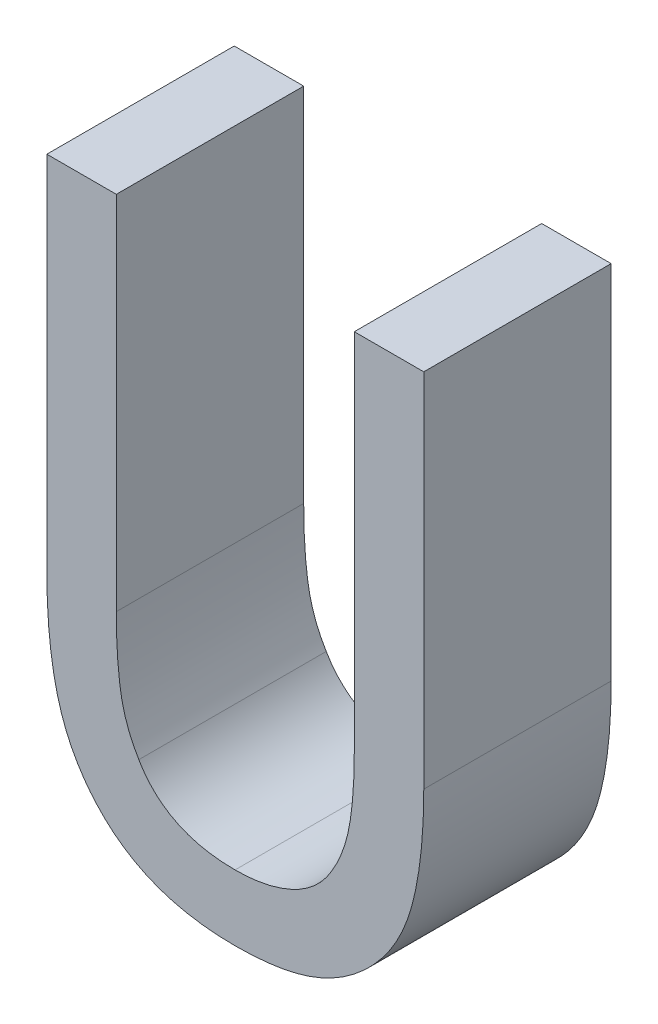
ISO-10303-21;
HEADER;
FILE_DESCRIPTION(('STEP AP214'),'2;1');
FILE_NAME('part.step','',(''),(''),'','','');
FILE_SCHEMA(('AUTOMOTIVE_DESIGN { 1 0 10303 214 1 1 1 1 }'));
ENDSEC;
DATA;
#1=APPLICATION_CONTEXT('core data for automotive mechanical design processes');
#2=APPLICATION_PROTOCOL_DEFINITION('international standard','automotive_design',2000,#1);
#3=PRODUCT_CONTEXT('',#1,'mechanical');
#4=PRODUCT('Part','Part','',(#3));
#5=PRODUCT_RELATED_PRODUCT_CATEGORY('part','',(#4));
#6=PRODUCT_DEFINITION_FORMATION('','',#4);
#7=PRODUCT_DEFINITION_CONTEXT('part definition',#1,'design');
#8=PRODUCT_DEFINITION('design','',#6,#7);
#9=PRODUCT_DEFINITION_SHAPE('','',#8);
#10=(LENGTH_UNIT() NAMED_UNIT(*) SI_UNIT(.MILLI.,.METRE.));
#11=(NAMED_UNIT(*) PLANE_ANGLE_UNIT() SI_UNIT($,.RADIAN.));
#12=(NAMED_UNIT(*) SI_UNIT($,.STERADIAN.) SOLID_ANGLE_UNIT());
#13=UNCERTAINTY_MEASURE_WITH_UNIT(LENGTH_MEASURE(1.E-05),#10,'distance_accuracy_value','');
#14=(GEOMETRIC_REPRESENTATION_CONTEXT(3) GLOBAL_UNCERTAINTY_ASSIGNED_CONTEXT((#13)) GLOBAL_UNIT_ASSIGNED_CONTEXT((#10,
#11,#12)) REPRESENTATION_CONTEXT('',''));
#15=CARTESIAN_POINT('',(0.,0.,0.));
#16=DIRECTION('',(0.,0.,1.));
#17=DIRECTION('',(1.,0.,0.));
#18=AXIS2_PLACEMENT_3D('',#15,#16,#17);
#19=CARTESIAN_POINT('',(-4.582835888152,0.305654139269393,0.));
#20=CARTESIAN_POINT('',(-4.582835888152,0.305654139269393,0.1));
#21=CARTESIAN_POINT('',(-4.582835888152,0.272589610839093,0.));
#22=CARTESIAN_POINT('',(-4.582835888152,0.272589610839093,0.1));
#23=CARTESIAN_POINT('',(-4.570812423269,0.227501617525047,0.));
#24=CARTESIAN_POINT('',(-4.570812423269,0.227501617525047,0.1));
#25=CARTESIAN_POINT('',(-4.556284069868,0.211470331013386,0.));
#26=CARTESIAN_POINT('',(-4.556284069868,0.211470331013386,0.1));
#27=B_SPLINE_SURFACE_WITH_KNOTS('',2,1,((#19,#20),(#21,#22),(#23,#24),(#25,#26)),.UNSPECIFIED.,
.F.,.F.,.F.,(3,1,3),(2,2),(-2.,-1.,0.),(0.,0.01),.UNSPECIFIED.);
#28=CARTESIAN_POINT('',(-4.556284069868,0.211470331013386,0.));
#29=CARTESIAN_POINT('',(-4.570812423269,0.227501617525047,0.));
#30=CARTESIAN_POINT('',(-4.582835888152,0.272589610839093,0.));
#31=CARTESIAN_POINT('',(-4.582835888152,0.305654139269393,0.));
#32=B_SPLINE_CURVE_WITH_KNOTS('',2,(#28,#29,#30,#31),.UNSPECIFIED.,.F.,.F.,(3,1,3),(0.,1.,2.),.UNSPECIFIED.);
#33=CARTESIAN_POINT('',(-4.556284069868,0.211470331013386,0.));
#34=VERTEX_POINT('',#33);
#35=CARTESIAN_POINT('',(-4.582835888152,0.305654139269393,0.));
#36=VERTEX_POINT('',#35);
#37=EDGE_CURVE('E11',#34,#36,#32,.T.);
#38=DIRECTION('',(0.,0.,1.));
#39=VECTOR('',#38,1.);
#40=CARTESIAN_POINT('',(-4.556284069868,0.211470331013386,0.));
#41=LINE('',#40,#39);
#42=CARTESIAN_POINT('',(-4.556284069868,0.211470331013386,0.1));
#43=VERTEX_POINT('',#42);
#44=EDGE_CURVE('E28',#34,#43,#41,.T.);
#45=CARTESIAN_POINT('',(-4.582835888152,0.305654139269393,0.1));
#46=CARTESIAN_POINT('',(-4.582835888152,0.272589610839093,0.1));
#47=CARTESIAN_POINT('',(-4.570812423269,0.227501617525047,0.1));
#48=CARTESIAN_POINT('',(-4.556284069868,0.211470331013386,0.1));
#49=B_SPLINE_CURVE_WITH_KNOTS('',2,(#45,#46,#47,#48),.UNSPECIFIED.,.F.,.F.,(3,1,3),(-2.,-1.,0.),.UNSPECIFIED.);
#50=CARTESIAN_POINT('',(-4.582835888152,0.305654139269393,0.1));
#51=VERTEX_POINT('',#50);
#52=EDGE_CURVE('E140',#51,#43,#49,.T.);
#53=DIRECTION('',(0.,0.,1.));
#54=VECTOR('',#53,1.);
#55=CARTESIAN_POINT('',(-4.582835888152,0.305654139269393,0.));
#56=LINE('',#55,#54);
#57=EDGE_CURVE('E299',#36,#51,#56,.T.);
#58=ORIENTED_EDGE('',*,*,#37,.F.);
#59=ORIENTED_EDGE('',*,*,#44,.T.);
#60=ORIENTED_EDGE('',*,*,#52,.F.);
#61=ORIENTED_EDGE('',*,*,#57,.F.);
#62=EDGE_LOOP('',(#58,#59,#60,#61));
#63=FACE_BOUND('',#62,.T.);
#64=ADVANCED_FACE('F17',(#63),#27,.T.);
#65=CARTESIAN_POINT('',(-4.582835888152,0.498530555112812,0.));
#66=DIRECTION('',(-1.,0.,0.));
#67=DIRECTION('',(0.,-1.,0.));
#68=AXIS2_PLACEMENT_3D('',#65,#66,#67);
#69=PLANE('',#68);
#70=DIRECTION('',(0.,1.,0.));
#71=VECTOR('',#70,1.);
#72=CARTESIAN_POINT('',(-4.582835888152,0.305654139269393,0.));
#73=LINE('',#72,#71);
#74=CARTESIAN_POINT('',(-4.582835888152,0.498530555112812,0.));
#75=VERTEX_POINT('',#74);
#76=EDGE_CURVE('E297',#36,#75,#73,.T.);
#77=ORIENTED_EDGE('',*,*,#76,.F.);
#78=ORIENTED_EDGE('',*,*,#57,.T.);
#79=DIRECTION('',(0.,-1.,0.));
#80=VECTOR('',#79,1.);
#81=CARTESIAN_POINT('',(-4.582835888152,0.305654139269393,0.1));
#82=LINE('',#81,#80);
#83=CARTESIAN_POINT('',(-4.582835888152,0.498530555112812,0.1));
#84=VERTEX_POINT('',#83);
#85=EDGE_CURVE('E295',#84,#51,#82,.T.);
#86=ORIENTED_EDGE('',*,*,#85,.F.);
#87=DIRECTION('',(0.,0.,1.));
#88=VECTOR('',#87,1.);
#89=CARTESIAN_POINT('',(-4.582835888152,0.498530555112812,0.));
#90=LINE('',#89,#88);
#91=EDGE_CURVE('E292',#75,#84,#90,.T.);
#92=ORIENTED_EDGE('',*,*,#91,.F.);
#93=EDGE_LOOP('',(#77,#78,#86,#92));
#94=FACE_BOUND('',#93,.T.);
#95=ADVANCED_FACE('F350',(#94),#69,.T.);
#96=CARTESIAN_POINT('',(-4.545763538094,0.498530555112812,0.));
#97=DIRECTION('',(0.,1.,0.));
#98=DIRECTION('',(-1.,0.,0.));
#99=AXIS2_PLACEMENT_3D('',#96,#97,#98);
#100=PLANE('',#99);
#101=DIRECTION('',(1.,0.,0.));
#102=VECTOR('',#101,1.);
#103=CARTESIAN_POINT('',(-4.582835888152,0.498530555112812,0.));
#104=LINE('',#103,#102);
#105=CARTESIAN_POINT('',(-4.545763538094,0.498530555112812,0.));
#106=VERTEX_POINT('',#105);
#107=EDGE_CURVE('E290',#75,#106,#104,.T.);
#108=ORIENTED_EDGE('',*,*,#107,.F.);
#109=ORIENTED_EDGE('',*,*,#91,.T.);
#110=DIRECTION('',(-1.,0.,0.));
#111=VECTOR('',#110,1.);
#112=CARTESIAN_POINT('',(-4.582835888152,0.498530555112812,0.1));
#113=LINE('',#112,#111);
#114=CARTESIAN_POINT('',(-4.545763538094,0.498530555112812,0.1));
#115=VERTEX_POINT('',#114);
#116=EDGE_CURVE('E287',#115,#84,#113,.T.);
#117=ORIENTED_EDGE('',*,*,#116,.F.);
#118=DIRECTION('',(0.,0.,1.));
#119=VECTOR('',#118,1.);
#120=CARTESIAN_POINT('',(-4.545763538094,0.498530555112812,0.));
#121=LINE('',#120,#119);
#122=EDGE_CURVE('E284',#106,#115,#121,.T.);
#123=ORIENTED_EDGE('',*,*,#122,.F.);
#124=EDGE_LOOP('',(#108,#109,#117,#123));
#125=FACE_BOUND('',#124,.T.);
#126=ADVANCED_FACE('F346',(#125),#100,.T.);
#127=CARTESIAN_POINT('',(-4.545763538094,0.305654139269393,0.));
#128=DIRECTION('',(1.,0.,0.));
#129=DIRECTION('',(0.,1.,0.));
#130=AXIS2_PLACEMENT_3D('',#127,#128,#129);
#131=PLANE('',#130);
#132=DIRECTION('',(0.,-1.,0.));
#133=VECTOR('',#132,1.);
#134=CARTESIAN_POINT('',(-4.545763538094,0.498530555112812,0.));
#135=LINE('',#134,#133);
#136=CARTESIAN_POINT('',(-4.545763538094,0.305654139269393,0.));
#137=VERTEX_POINT('',#136);
#138=EDGE_CURVE('E282',#106,#137,#135,.T.);
#139=ORIENTED_EDGE('',*,*,#138,.F.);
#140=ORIENTED_EDGE('',*,*,#122,.T.);
#141=DIRECTION('',(0.,1.,0.));
#142=VECTOR('',#141,1.);
#143=CARTESIAN_POINT('',(-4.545763538094,0.498530555112812,0.1));
#144=LINE('',#143,#142);
#145=CARTESIAN_POINT('',(-4.545763538094,0.305654139269393,0.1));
#146=VERTEX_POINT('',#145);
#147=EDGE_CURVE('E279',#146,#115,#144,.T.);
#148=ORIENTED_EDGE('',*,*,#147,.F.);
#149=DIRECTION('',(0.,0.,1.));
#150=VECTOR('',#149,1.);
#151=CARTESIAN_POINT('',(-4.545763538094,0.305654139269393,0.));
#152=LINE('',#151,#150);
#153=EDGE_CURVE('E273',#137,#146,#152,.T.);
#154=ORIENTED_EDGE('',*,*,#153,.F.);
#155=EDGE_LOOP('',(#139,#140,#148,#154));
#156=FACE_BOUND('',#155,.T.);
#157=ADVANCED_FACE('F342',(#156),#131,.T.);
#158=CARTESIAN_POINT('',(-4.533740073211,0.243282415184963,0.));
#159=CARTESIAN_POINT('',(-4.533740073211,0.243282415184963,0.1));
#160=CARTESIAN_POINT('',(-4.541004249911,0.255055391216964,0.));
#161=CARTESIAN_POINT('',(-4.541004249911,0.255055391216964,0.1));
#162=CARTESIAN_POINT('',(-4.545763538094,0.284112098019349,0.));
#163=CARTESIAN_POINT('',(-4.545763538094,0.284112098019349,0.1));
#164=CARTESIAN_POINT('',(-4.545763538094,0.305654139269393,0.));
#165=CARTESIAN_POINT('',(-4.545763538094,0.305654139269393,0.1));
#166=B_SPLINE_SURFACE_WITH_KNOTS('',2,1,((#158,#159),(#160,#161),(#162,#163),(#164,#165)),
.UNSPECIFIED.,.F.,.F.,.F.,(3,1,3),(2,2),(-2.,-1.,0.),(0.,0.01),.UNSPECIFIED.);
#167=CARTESIAN_POINT('',(-4.545763538094,0.305654139269393,0.));
#168=CARTESIAN_POINT('',(-4.545763538094,0.284112098019349,0.));
#169=CARTESIAN_POINT('',(-4.541004249911,0.255055391216964,0.));
#170=CARTESIAN_POINT('',(-4.533740073211,0.243282415184963,0.));
#171=B_SPLINE_CURVE_WITH_KNOTS('',2,(#167,#168,#169,#170),.UNSPECIFIED.,.F.,.F.,(3,1,3),(0.,1.,
2.),.UNSPECIFIED.);
#172=CARTESIAN_POINT('',(-4.533740073211,0.243282415184963,0.));
#173=VERTEX_POINT('',#172);
#174=EDGE_CURVE('E266',#137,#173,#171,.T.);
#175=CARTESIAN_POINT('',(-4.533740073211,0.243282415184963,0.1));
#176=CARTESIAN_POINT('',(-4.541004249911,0.255055391216964,0.1));
#177=CARTESIAN_POINT('',(-4.545763538094,0.284112098019349,0.1));
#178=CARTESIAN_POINT('',(-4.545763538094,0.305654139269393,0.1));
#179=B_SPLINE_CURVE_WITH_KNOTS('',2,(#175,#176,#177,#178),.UNSPECIFIED.,.F.,.F.,(3,1,3),(-2.,
-1.,0.),.UNSPECIFIED.);
#180=CARTESIAN_POINT('',(-4.533740073211,0.243282415184963,0.1));
#181=VERTEX_POINT('',#180);
#182=EDGE_CURVE('E261',#181,#146,#179,.T.);
#183=DIRECTION('',(0.,0.,1.));
#184=VECTOR('',#183,1.);
#185=CARTESIAN_POINT('',(-4.533740073211,0.243282415184963,0.));
#186=LINE('',#185,#184);
#187=EDGE_CURVE('E255',#173,#181,#186,.T.);
#188=ORIENTED_EDGE('',*,*,#174,.F.);
#189=ORIENTED_EDGE('',*,*,#153,.T.);
#190=ORIENTED_EDGE('',*,*,#182,.F.);
#191=ORIENTED_EDGE('',*,*,#187,.F.);
#192=EDGE_LOOP('',(#188,#189,#190,#191));
#193=FACE_BOUND('',#192,.T.);
#194=ADVANCED_FACE('F338',(#193),#166,.T.);
#195=CARTESIAN_POINT('',(-4.482389858603,0.217983041158748,0.));
#196=CARTESIAN_POINT('',(-4.482389858603,0.217983041158748,0.1));
#197=CARTESIAN_POINT('',(-4.500926033632,0.217983041158748,0.));
#198=CARTESIAN_POINT('',(-4.500926033632,0.217983041158748,0.1));
#199=CARTESIAN_POINT('',(-4.52647589651,0.230757972597728,0.));
#200=CARTESIAN_POINT('',(-4.52647589651,0.230757972597728,0.1));
#201=CARTESIAN_POINT('',(-4.533740073211,0.243282415184963,0.));
#202=CARTESIAN_POINT('',(-4.533740073211,0.243282415184963,0.1));
#203=B_SPLINE_SURFACE_WITH_KNOTS('',2,1,((#195,#196),(#197,#198),(#199,#200),(#201,#202)),
.UNSPECIFIED.,.F.,.F.,.F.,(3,1,3),(2,2),(-2.,-1.,0.),(0.,0.01),.UNSPECIFIED.);
#204=CARTESIAN_POINT('',(-4.533740073211,0.243282415184963,0.));
#205=CARTESIAN_POINT('',(-4.52647589651,0.230757972597728,0.));
#206=CARTESIAN_POINT('',(-4.500926033632,0.217983041158748,0.));
#207=CARTESIAN_POINT('',(-4.482389858603,0.217983041158748,0.));
#208=B_SPLINE_CURVE_WITH_KNOTS('',2,(#204,#205,#206,#207),.UNSPECIFIED.,.F.,.F.,(3,1,3),(0.,1.,
2.),.UNSPECIFIED.);
#209=CARTESIAN_POINT('',(-4.482389858603,0.217983041158748,0.));
#210=VERTEX_POINT('',#209);
#211=EDGE_CURVE('E248',#173,#210,#208,.T.);
#212=CARTESIAN_POINT('',(-4.482389858603,0.217983041158748,0.1));
#213=CARTESIAN_POINT('',(-4.500926033632,0.217983041158748,0.1));
#214=CARTESIAN_POINT('',(-4.52647589651,0.230757972597728,0.1));
#215=CARTESIAN_POINT('',(-4.533740073211,0.243282415184963,0.1));
#216=B_SPLINE_CURVE_WITH_KNOTS('',2,(#212,#213,#214,#215),.UNSPECIFIED.,.F.,.F.,(3,1,3),(-2.,
-1.,0.),.UNSPECIFIED.);
#217=CARTESIAN_POINT('',(-4.482389858603,0.217983041158748,0.1));
#218=VERTEX_POINT('',#217);
#219=EDGE_CURVE('E243',#218,#181,#216,.T.);
#220=DIRECTION('',(0.,0.,1.));
#221=VECTOR('',#220,1.);
#222=CARTESIAN_POINT('',(-4.482389858603,0.217983041158748,0.));
#223=LINE('',#222,#221);
#224=EDGE_CURVE('E237',#210,#218,#223,.T.);
#225=ORIENTED_EDGE('',*,*,#211,.F.);
#226=ORIENTED_EDGE('',*,*,#187,.T.);
#227=ORIENTED_EDGE('',*,*,#219,.F.);
#228=ORIENTED_EDGE('',*,*,#224,.F.);
#229=EDGE_LOOP('',(#225,#226,#227,#228));
#230=FACE_BOUND('',#229,.T.);
#231=ADVANCED_FACE('F334',(#230),#203,.T.);
#232=CARTESIAN_POINT('',(-4.430789155143,0.243282415184963,0.));
#233=CARTESIAN_POINT('',(-4.430789155143,0.243282415184963,0.1));
#234=CARTESIAN_POINT('',(-4.438053331844,0.230757972597728,0.));
#235=CARTESIAN_POINT('',(-4.438053331844,0.230757972597728,0.1));
#236=CARTESIAN_POINT('',(-4.465106127832,0.217983041158748,0.));
#237=CARTESIAN_POINT('',(-4.465106127832,0.217983041158748,0.1));
#238=CARTESIAN_POINT('',(-4.482389858603,0.217983041158748,0.));
#239=CARTESIAN_POINT('',(-4.482389858603,0.217983041158748,0.1));
#240=B_SPLINE_SURFACE_WITH_KNOTS('',2,1,((#232,#233),(#234,#235),(#236,#237),(#238,#239)),
.UNSPECIFIED.,.F.,.F.,.F.,(3,1,3),(2,2),(-2.,-1.,0.),(0.,0.01),.UNSPECIFIED.);
#241=CARTESIAN_POINT('',(-4.482389858603,0.217983041158748,0.));
#242=CARTESIAN_POINT('',(-4.465106127832,0.217983041158748,0.));
#243=CARTESIAN_POINT('',(-4.438053331844,0.230757972597728,0.));
#244=CARTESIAN_POINT('',(-4.430789155143,0.243282415184963,0.));
#245=B_SPLINE_CURVE_WITH_KNOTS('',2,(#241,#242,#243,#244),.UNSPECIFIED.,.F.,.F.,(3,1,3),(0.,1.,
2.),.UNSPECIFIED.);
#246=CARTESIAN_POINT('',(-4.430789155143,0.243282415184963,0.));
#247=VERTEX_POINT('',#246);
#248=EDGE_CURVE('E230',#210,#247,#245,.T.);
#249=CARTESIAN_POINT('',(-4.430789155143,0.243282415184963,0.1));
#250=CARTESIAN_POINT('',(-4.438053331844,0.230757972597728,0.1));
#251=CARTESIAN_POINT('',(-4.465106127832,0.217983041158748,0.1));
#252=CARTESIAN_POINT('',(-4.482389858603,0.217983041158748,0.1));
#253=B_SPLINE_CURVE_WITH_KNOTS('',2,(#249,#250,#251,#252),.UNSPECIFIED.,.F.,.F.,(3,1,3),(-2.,
-1.,0.),.UNSPECIFIED.);
#254=CARTESIAN_POINT('',(-4.430789155143,0.243282415184963,0.1));
#255=VERTEX_POINT('',#254);
#256=EDGE_CURVE('E225',#255,#218,#253,.T.);
#257=DIRECTION('',(0.,0.,1.));
#258=VECTOR('',#257,1.);
#259=CARTESIAN_POINT('',(-4.430789155143,0.243282415184963,0.));
#260=LINE('',#259,#258);
#261=EDGE_CURVE('E219',#247,#255,#260,.T.);
#262=ORIENTED_EDGE('',*,*,#248,.F.);
#263=ORIENTED_EDGE('',*,*,#224,.T.);
#264=ORIENTED_EDGE('',*,*,#256,.F.);
#265=ORIENTED_EDGE('',*,*,#261,.F.);
#266=EDGE_LOOP('',(#262,#263,#264,#265));
#267=FACE_BOUND('',#266,.T.);
#268=ADVANCED_FACE('F330',(#267),#240,.T.);
#269=CARTESIAN_POINT('',(-4.41876569026,0.304652183862414,0.));
#270=CARTESIAN_POINT('',(-4.41876569026,0.304652183862414,0.1));
#271=CARTESIAN_POINT('',(-4.41876569026,0.283861609167604,0.));
#272=CARTESIAN_POINT('',(-4.41876569026,0.283861609167604,0.1));
#273=CARTESIAN_POINT('',(-4.423775467295,0.255055391216964,0.));
#274=CARTESIAN_POINT('',(-4.423775467295,0.255055391216964,0.1));
#275=CARTESIAN_POINT('',(-4.430789155143,0.243282415184963,0.));
#276=CARTESIAN_POINT('',(-4.430789155143,0.243282415184963,0.1));
#277=B_SPLINE_SURFACE_WITH_KNOTS('',2,1,((#269,#270),(#271,#272),(#273,#274),(#275,#276)),
.UNSPECIFIED.,.F.,.F.,.F.,(3,1,3),(2,2),(-2.,-1.,0.),(0.,0.01),.UNSPECIFIED.);
#278=CARTESIAN_POINT('',(-4.430789155143,0.243282415184963,0.));
#279=CARTESIAN_POINT('',(-4.423775467295,0.255055391216964,0.));
#280=CARTESIAN_POINT('',(-4.41876569026,0.283861609167604,0.));
#281=CARTESIAN_POINT('',(-4.41876569026,0.304652183862414,0.));
#282=B_SPLINE_CURVE_WITH_KNOTS('',2,(#278,#279,#280,#281),.UNSPECIFIED.,.F.,.F.,(3,1,3),(0.,1.,
2.),.UNSPECIFIED.);
#283=CARTESIAN_POINT('',(-4.41876569026,0.304652183862414,0.));
#284=VERTEX_POINT('',#283);
#285=EDGE_CURVE('E212',#247,#284,#282,.T.);
#286=CARTESIAN_POINT('',(-4.41876569026,0.304652183862414,0.1));
#287=CARTESIAN_POINT('',(-4.41876569026,0.283861609167604,0.1));
#288=CARTESIAN_POINT('',(-4.423775467295,0.255055391216964,0.1));
#289=CARTESIAN_POINT('',(-4.430789155143,0.243282415184963,0.1));
#290=B_SPLINE_CURVE_WITH_KNOTS('',2,(#286,#287,#288,#289),.UNSPECIFIED.,.F.,.F.,(3,1,3),(-2.,
-1.,0.),.UNSPECIFIED.);
#291=CARTESIAN_POINT('',(-4.41876569026,0.304652183862414,0.1));
#292=VERTEX_POINT('',#291);
#293=EDGE_CURVE('E207',#292,#255,#290,.T.);
#294=DIRECTION('',(0.,0.,1.));
#295=VECTOR('',#294,1.);
#296=CARTESIAN_POINT('',(-4.41876569026,0.304652183862414,0.));
#297=LINE('',#296,#295);
#298=EDGE_CURVE('E204',#284,#292,#297,.T.);
#299=ORIENTED_EDGE('',*,*,#285,.F.);
#300=ORIENTED_EDGE('',*,*,#261,.T.);
#301=ORIENTED_EDGE('',*,*,#293,.F.);
#302=ORIENTED_EDGE('',*,*,#298,.F.);
#303=EDGE_LOOP('',(#299,#300,#301,#302));
#304=FACE_BOUND('',#303,.T.);
#305=ADVANCED_FACE('F326',(#304),#277,.T.);
#306=CARTESIAN_POINT('',(-4.41876569026,0.498530555112812,0.));
#307=DIRECTION('',(-1.,0.,0.));
#308=DIRECTION('',(0.,-1.,0.));
#309=AXIS2_PLACEMENT_3D('',#306,#307,#308);
#310=PLANE('',#309);
#311=DIRECTION('',(0.,1.,0.));
#312=VECTOR('',#311,1.);
#313=CARTESIAN_POINT('',(-4.41876569026,0.304652183862414,0.));
#314=LINE('',#313,#312);
#315=CARTESIAN_POINT('',(-4.41876569026,0.498530555112812,0.));
#316=VERTEX_POINT('',#315);
#317=EDGE_CURVE('E202',#284,#316,#314,.T.);
#318=ORIENTED_EDGE('',*,*,#317,.F.);
#319=ORIENTED_EDGE('',*,*,#298,.T.);
#320=DIRECTION('',(0.,-1.,0.));
#321=VECTOR('',#320,1.);
#322=CARTESIAN_POINT('',(-4.41876569026,0.304652183862414,0.1));
#323=LINE('',#322,#321);
#324=CARTESIAN_POINT('',(-4.41876569026,0.498530555112812,0.1));
#325=VERTEX_POINT('',#324);
#326=EDGE_CURVE('E199',#325,#292,#323,.T.);
#327=ORIENTED_EDGE('',*,*,#326,.F.);
#328=DIRECTION('',(0.,0.,1.));
#329=VECTOR('',#328,1.);
#330=CARTESIAN_POINT('',(-4.41876569026,0.498530555112812,0.));
#331=LINE('',#330,#329);
#332=EDGE_CURVE('E196',#316,#325,#331,.T.);
#333=ORIENTED_EDGE('',*,*,#332,.F.);
#334=EDGE_LOOP('',(#318,#319,#327,#333));
#335=FACE_BOUND('',#334,.T.);
#336=ADVANCED_FACE('F322',(#335),#310,.T.);
#337=CARTESIAN_POINT('',(-4.381693340201,0.498530555112812,0.));
#338=DIRECTION('',(0.,1.,0.));
#339=DIRECTION('',(-1.,0.,0.));
#340=AXIS2_PLACEMENT_3D('',#337,#338,#339);
#341=PLANE('',#340);
#342=DIRECTION('',(1.,0.,0.));
#343=VECTOR('',#342,1.);
#344=CARTESIAN_POINT('',(-4.41876569026,0.498530555112812,0.));
#345=LINE('',#344,#343);
#346=CARTESIAN_POINT('',(-4.381693340201,0.498530555112812,0.));
#347=VERTEX_POINT('',#346);
#348=EDGE_CURVE('E194',#316,#347,#345,.T.);
#349=ORIENTED_EDGE('',*,*,#348,.F.);
#350=ORIENTED_EDGE('',*,*,#332,.T.);
#351=DIRECTION('',(-1.,0.,0.));
#352=VECTOR('',#351,1.);
#353=CARTESIAN_POINT('',(-4.41876569026,0.498530555112812,0.1));
#354=LINE('',#353,#352);
#355=CARTESIAN_POINT('',(-4.381693340201,0.498530555112812,0.1));
#356=VERTEX_POINT('',#355);
#357=EDGE_CURVE('E191',#356,#325,#354,.T.);
#358=ORIENTED_EDGE('',*,*,#357,.F.);
#359=DIRECTION('',(0.,0.,1.));
#360=VECTOR('',#359,1.);
#361=CARTESIAN_POINT('',(-4.381693340201,0.498530555112812,0.));
#362=LINE('',#361,#360);
#363=EDGE_CURVE('E188',#347,#356,#362,.T.);
#364=ORIENTED_EDGE('',*,*,#363,.F.);
#365=EDGE_LOOP('',(#349,#350,#358,#364));
#366=FACE_BOUND('',#365,.T.);
#367=ADVANCED_FACE('F318',(#366),#341,.T.);
#368=CARTESIAN_POINT('',(-4.381693340201,0.305654139269393,0.));
#369=DIRECTION('',(1.,0.,0.));
#370=DIRECTION('',(0.,1.,0.));
#371=AXIS2_PLACEMENT_3D('',#368,#369,#370);
#372=PLANE('',#371);
#373=DIRECTION('',(0.,-1.,0.));
#374=VECTOR('',#373,1.);
#375=CARTESIAN_POINT('',(-4.381693340201,0.498530555112812,0.));
#376=LINE('',#375,#374);
#377=CARTESIAN_POINT('',(-4.381693340201,0.305654139269393,0.));
#378=VERTEX_POINT('',#377);
#379=EDGE_CURVE('E186',#347,#378,#376,.T.);
#380=ORIENTED_EDGE('',*,*,#379,.F.);
#381=ORIENTED_EDGE('',*,*,#363,.T.);
#382=DIRECTION('',(0.,1.,0.));
#383=VECTOR('',#382,1.);
#384=CARTESIAN_POINT('',(-4.381693340201,0.498530555112812,0.1));
#385=LINE('',#384,#383);
#386=CARTESIAN_POINT('',(-4.381693340201,0.305654139269393,0.1));
#387=VERTEX_POINT('',#386);
#388=EDGE_CURVE('E183',#387,#356,#385,.T.);
#389=ORIENTED_EDGE('',*,*,#388,.F.);
#390=DIRECTION('',(0.,0.,1.));
#391=VECTOR('',#390,1.);
#392=CARTESIAN_POINT('',(-4.381693340201,0.305654139269393,0.));
#393=LINE('',#392,#391);
#394=EDGE_CURVE('E177',#378,#387,#393,.T.);
#395=ORIENTED_EDGE('',*,*,#394,.F.);
#396=EDGE_LOOP('',(#380,#381,#389,#395));
#397=FACE_BOUND('',#396,.T.);
#398=ADVANCED_FACE('F314',(#397),#372,.T.);
#399=CARTESIAN_POINT('',(-4.408245158486,0.211470331013386,0.));
#400=CARTESIAN_POINT('',(-4.408245158486,0.211470331013386,0.1));
#401=CARTESIAN_POINT('',(-4.393466316233,0.227251128673302,0.));
#402=CARTESIAN_POINT('',(-4.393466316233,0.227251128673302,0.1));
#403=CARTESIAN_POINT('',(-4.381693340201,0.273341077394327,0.));
#404=CARTESIAN_POINT('',(-4.381693340201,0.273341077394327,0.1));
#405=CARTESIAN_POINT('',(-4.381693340201,0.305654139269393,0.));
#406=CARTESIAN_POINT('',(-4.381693340201,0.305654139269393,0.1));
#407=B_SPLINE_SURFACE_WITH_KNOTS('',2,1,((#399,#400),(#401,#402),(#403,#404),(#405,#406)),
.UNSPECIFIED.,.F.,.F.,.F.,(3,1,3),(2,2),(-2.,-1.,0.),(0.,0.01),.UNSPECIFIED.);
#408=CARTESIAN_POINT('',(-4.381693340201,0.305654139269393,0.));
#409=CARTESIAN_POINT('',(-4.381693340201,0.273341077394327,0.));
#410=CARTESIAN_POINT('',(-4.393466316233,0.227251128673302,0.));
#411=CARTESIAN_POINT('',(-4.408245158486,0.211470331013386,0.));
#412=B_SPLINE_CURVE_WITH_KNOTS('',2,(#408,#409,#410,#411),.UNSPECIFIED.,.F.,.F.,(3,1,3),(0.,1.,
2.),.UNSPECIFIED.);
#413=CARTESIAN_POINT('',(-4.408245158486,0.211470331013386,0.));
#414=VERTEX_POINT('',#413);
#415=EDGE_CURVE('E170',#378,#414,#412,.T.);
#416=CARTESIAN_POINT('',(-4.408245158486,0.211470331013386,0.1));
#417=CARTESIAN_POINT('',(-4.393466316233,0.227251128673302,0.1));
#418=CARTESIAN_POINT('',(-4.381693340201,0.273341077394327,0.1));
#419=CARTESIAN_POINT('',(-4.381693340201,0.305654139269393,0.1));
#420=B_SPLINE_CURVE_WITH_KNOTS('',2,(#416,#417,#418,#419),.UNSPECIFIED.,.F.,.F.,(3,1,3),(-2.,
-1.,0.),.UNSPECIFIED.);
#421=CARTESIAN_POINT('',(-4.408245158486,0.211470331013386,0.1));
#422=VERTEX_POINT('',#421);
#423=EDGE_CURVE('E166',#422,#387,#420,.T.);
#424=DIRECTION('',(0.,0.,1.));
#425=VECTOR('',#424,1.);
#426=CARTESIAN_POINT('',(-4.408245158486,0.211470331013386,0.));
#427=LINE('',#426,#425);
#428=EDGE_CURVE('E125',#414,#422,#427,.T.);
#429=ORIENTED_EDGE('',*,*,#415,.F.);
#430=ORIENTED_EDGE('',*,*,#394,.T.);
#431=ORIENTED_EDGE('',*,*,#423,.F.);
#432=ORIENTED_EDGE('',*,*,#428,.F.);
#433=EDGE_LOOP('',(#429,#430,#431,#432));
#434=FACE_BOUND('',#433,.T.);
#435=ADVANCED_FACE('F312',(#434),#407,.T.);
#436=CARTESIAN_POINT('',(-4.482389858603,0.18291460191449,0.));
#437=CARTESIAN_POINT('',(-4.482389858603,0.18291460191449,0.1));
#438=CARTESIAN_POINT('',(-4.456839995725,0.18291460191449,0.));
#439=CARTESIAN_POINT('',(-4.456839995725,0.18291460191449,0.1));
#440=CARTESIAN_POINT('',(-4.421521067629,0.196941977612193,0.));
#441=CARTESIAN_POINT('',(-4.421521067629,0.196941977612193,0.1));
#442=CARTESIAN_POINT('',(-4.408245158486,0.211470331013386,0.));
#443=CARTESIAN_POINT('',(-4.408245158486,0.211470331013386,0.1));
#444=B_SPLINE_SURFACE_WITH_KNOTS('',2,1,((#436,#437),(#438,#439),(#440,#441),(#442,#443)),
.UNSPECIFIED.,.F.,.F.,.F.,(3,1,3),(2,2),(-2.,-1.,0.),(0.,0.01),.UNSPECIFIED.);
#445=CARTESIAN_POINT('',(-4.408245158486,0.211470331013386,0.));
#446=CARTESIAN_POINT('',(-4.421521067629,0.196941977612193,0.));
#447=CARTESIAN_POINT('',(-4.456839995725,0.18291460191449,0.));
#448=CARTESIAN_POINT('',(-4.482389858603,0.18291460191449,0.));
#449=B_SPLINE_CURVE_WITH_KNOTS('',2,(#445,#446,#447,#448),.UNSPECIFIED.,.F.,.F.,(3,1,3),(0.,1.,
2.),.UNSPECIFIED.);
#450=CARTESIAN_POINT('',(-4.482389858603,0.18291460191449,0.));
#451=VERTEX_POINT('',#450);
#452=EDGE_CURVE('E129',#414,#451,#449,.T.);
#453=CARTESIAN_POINT('',(-4.482389858603,0.18291460191449,0.1));
#454=CARTESIAN_POINT('',(-4.456839995725,0.18291460191449,0.1));
#455=CARTESIAN_POINT('',(-4.421521067629,0.196941977612193,0.1));
#456=CARTESIAN_POINT('',(-4.408245158486,0.211470331013386,0.1));
#457=B_SPLINE_CURVE_WITH_KNOTS('',2,(#453,#454,#455,#456),.UNSPECIFIED.,.F.,.F.,(3,1,3),(-2.,
-1.,0.),.UNSPECIFIED.);
#458=CARTESIAN_POINT('',(-4.482389858603,0.18291460191449,0.1));
#459=VERTEX_POINT('',#458);
#460=EDGE_CURVE('E118',#459,#422,#457,.T.);
#461=DIRECTION('',(0.,0.,1.));
#462=VECTOR('',#461,1.);
#463=CARTESIAN_POINT('',(-4.482389858603,0.18291460191449,0.));
#464=LINE('',#463,#462);
#465=EDGE_CURVE('E122',#451,#459,#464,.T.);
#466=ORIENTED_EDGE('',*,*,#452,.F.);
#467=ORIENTED_EDGE('',*,*,#428,.T.);
#468=ORIENTED_EDGE('',*,*,#460,.F.);
#469=ORIENTED_EDGE('',*,*,#465,.F.);
#470=EDGE_LOOP('',(#466,#467,#468,#469));
#471=FACE_BOUND('',#470,.T.);
#472=ADVANCED_FACE('F121',(#471),#444,.T.);
#473=CARTESIAN_POINT('',(-4.556284069868,0.211470331013386,0.));
#474=CARTESIAN_POINT('',(-4.556284069868,0.211470331013386,0.1));
#475=CARTESIAN_POINT('',(-4.543509138429,0.197192466463938,0.));
#476=CARTESIAN_POINT('',(-4.543509138429,0.197192466463938,0.1));
#477=CARTESIAN_POINT('',(-4.506937766074,0.18291460191449,0.));
#478=CARTESIAN_POINT('',(-4.506937766074,0.18291460191449,0.1));
#479=CARTESIAN_POINT('',(-4.482389858603,0.18291460191449,0.));
#480=CARTESIAN_POINT('',(-4.482389858603,0.18291460191449,0.1));
#481=B_SPLINE_SURFACE_WITH_KNOTS('',2,1,((#473,#474),(#475,#476),(#477,#478),(#479,#480)),
.UNSPECIFIED.,.F.,.F.,.F.,(3,1,3),(2,2),(-2.,-1.,0.),(0.,0.01),.UNSPECIFIED.);
#482=CARTESIAN_POINT('',(-4.482389858603,0.18291460191449,0.));
#483=CARTESIAN_POINT('',(-4.506937766074,0.18291460191449,0.));
#484=CARTESIAN_POINT('',(-4.543509138429,0.197192466463938,0.));
#485=CARTESIAN_POINT('',(-4.556284069868,0.211470331013386,0.));
#486=B_SPLINE_CURVE_WITH_KNOTS('',2,(#482,#483,#484,#485),.UNSPECIFIED.,.F.,.F.,(3,1,3),(0.,1.,
2.),.UNSPECIFIED.);
#487=EDGE_CURVE('E135',#451,#34,#486,.T.);
#488=CARTESIAN_POINT('',(-4.556284069868,0.211470331013386,0.1));
#489=CARTESIAN_POINT('',(-4.543509138429,0.197192466463938,0.1));
#490=CARTESIAN_POINT('',(-4.506937766074,0.18291460191449,0.1));
#491=CARTESIAN_POINT('',(-4.482389858603,0.18291460191449,0.1));
#492=B_SPLINE_CURVE_WITH_KNOTS('',2,(#488,#489,#490,#491),.UNSPECIFIED.,.F.,.F.,(3,1,3),(-2.,
-1.,0.),.UNSPECIFIED.);
#493=EDGE_CURVE('E134',#43,#459,#492,.T.);
#494=ORIENTED_EDGE('',*,*,#487,.F.);
#495=ORIENTED_EDGE('',*,*,#465,.T.);
#496=ORIENTED_EDGE('',*,*,#493,.F.);
#497=ORIENTED_EDGE('',*,*,#44,.F.);
#498=EDGE_LOOP('',(#494,#495,#496,#497));
#499=FACE_BOUND('',#498,.T.);
#500=ADVANCED_FACE('F133',(#499),#481,.T.);
#501=CARTESIAN_POINT('',(-4.482253880607,0.349356976109391,0.));
#502=DIRECTION('',(0.,0.,1.));
#503=DIRECTION('',(1.,0.,0.));
#504=AXIS2_PLACEMENT_3D('',#501,#502,#503);
#505=PLANE('',#504);
#506=ORIENTED_EDGE('',*,*,#487,.T.);
#507=ORIENTED_EDGE('',*,*,#37,.T.);
#508=ORIENTED_EDGE('',*,*,#76,.T.);
#509=ORIENTED_EDGE('',*,*,#107,.T.);
#510=ORIENTED_EDGE('',*,*,#138,.T.);
#511=ORIENTED_EDGE('',*,*,#174,.T.);
#512=ORIENTED_EDGE('',*,*,#211,.T.);
#513=ORIENTED_EDGE('',*,*,#248,.T.);
#514=ORIENTED_EDGE('',*,*,#285,.T.);
#515=ORIENTED_EDGE('',*,*,#317,.T.);
#516=ORIENTED_EDGE('',*,*,#348,.T.);
#517=ORIENTED_EDGE('',*,*,#379,.T.);
#518=ORIENTED_EDGE('',*,*,#415,.T.);
#519=ORIENTED_EDGE('',*,*,#452,.T.);
#520=EDGE_LOOP('',(#506,#507,#508,#509,#510,#511,#512,#513,#514,#515,#516,#517,#518,#519));
#521=FACE_BOUND('',#520,.T.);
#522=ADVANCED_FACE('F307',(#521),#505,.F.);
#523=CARTESIAN_POINT('',(-4.482253880607,0.349356976109391,0.1));
#524=DIRECTION('',(0.,0.,1.));
#525=DIRECTION('',(1.,0.,0.));
#526=AXIS2_PLACEMENT_3D('',#523,#524,#525);
#527=PLANE('',#526);
#528=ORIENTED_EDGE('',*,*,#493,.T.);
#529=ORIENTED_EDGE('',*,*,#460,.T.);
#530=ORIENTED_EDGE('',*,*,#423,.T.);
#531=ORIENTED_EDGE('',*,*,#388,.T.);
#532=ORIENTED_EDGE('',*,*,#357,.T.);
#533=ORIENTED_EDGE('',*,*,#326,.T.);
#534=ORIENTED_EDGE('',*,*,#293,.T.);
#535=ORIENTED_EDGE('',*,*,#256,.T.);
#536=ORIENTED_EDGE('',*,*,#219,.T.);
#537=ORIENTED_EDGE('',*,*,#182,.T.);
#538=ORIENTED_EDGE('',*,*,#147,.T.);
#539=ORIENTED_EDGE('',*,*,#116,.T.);
#540=ORIENTED_EDGE('',*,*,#85,.T.);
#541=ORIENTED_EDGE('',*,*,#52,.T.);
#542=EDGE_LOOP('',(#528,#529,#530,#531,#532,#533,#534,#535,#536,#537,#538,#539,#540,#541));
#543=FACE_BOUND('',#542,.T.);
#544=ADVANCED_FACE('F138',(#543),#527,.T.);
#545=CLOSED_SHELL('',(#64,#95,#126,#157,#194,#231,#268,#305,#336,#367,#398,#435,#472,#500,#522,#544));
#546=MANIFOLD_SOLID_BREP('B1',#545);
#547=ADVANCED_BREP_SHAPE_REPRESENTATION('',(#18,#546),#14);
#548=SHAPE_DEFINITION_REPRESENTATION(#9,#547);
ENDSEC;
END-ISO-10303-21;
